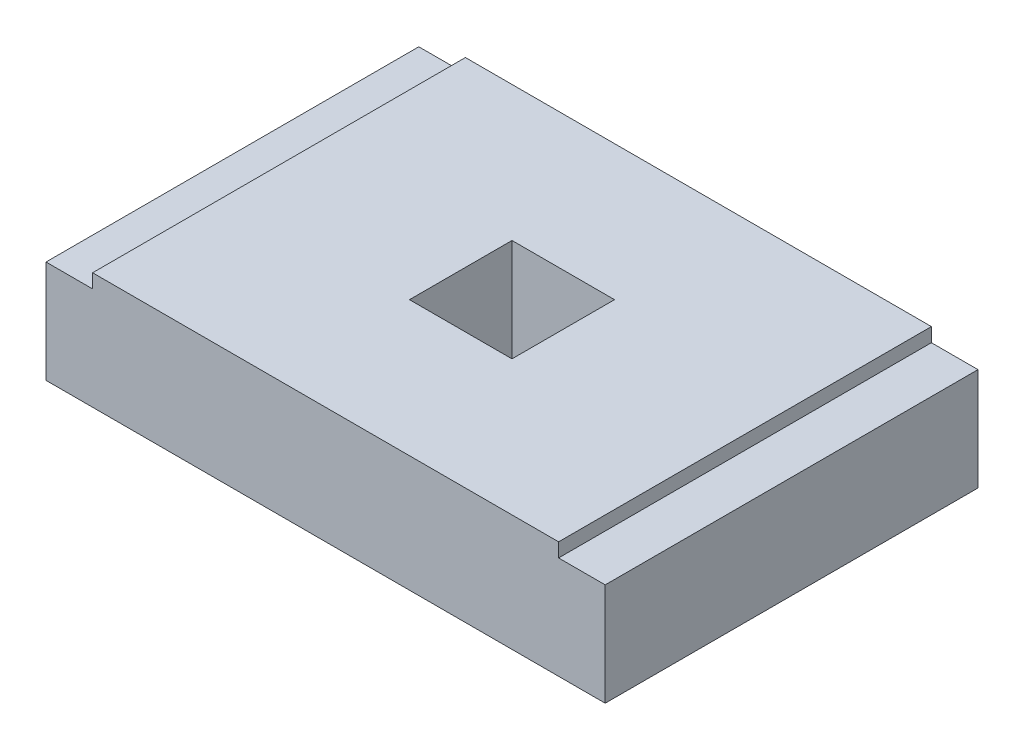
ISO-10303-21;
HEADER;
FILE_DESCRIPTION(('STEP AP214'),'2;1');
FILE_NAME('part.step','',(''),(''),'','','');
FILE_SCHEMA(('AUTOMOTIVE_DESIGN { 1 0 10303 214 1 1 1 1 }'));
ENDSEC;
DATA;
#1=APPLICATION_CONTEXT('core data for automotive mechanical design processes');
#2=APPLICATION_PROTOCOL_DEFINITION('international standard','automotive_design',2000,#1);
#3=PRODUCT_CONTEXT('',#1,'mechanical');
#4=PRODUCT('Part','Part','',(#3));
#5=PRODUCT_RELATED_PRODUCT_CATEGORY('part','',(#4));
#6=PRODUCT_DEFINITION_FORMATION('','',#4);
#7=PRODUCT_DEFINITION_CONTEXT('part definition',#1,'design');
#8=PRODUCT_DEFINITION('design','',#6,#7);
#9=PRODUCT_DEFINITION_SHAPE('','',#8);
#10=(LENGTH_UNIT() NAMED_UNIT(*) SI_UNIT(.MILLI.,.METRE.));
#11=(NAMED_UNIT(*) PLANE_ANGLE_UNIT() SI_UNIT($,.RADIAN.));
#12=(NAMED_UNIT(*) SI_UNIT($,.STERADIAN.) SOLID_ANGLE_UNIT());
#13=UNCERTAINTY_MEASURE_WITH_UNIT(LENGTH_MEASURE(1.E-05),#10,'distance_accuracy_value','');
#14=(GEOMETRIC_REPRESENTATION_CONTEXT(3) GLOBAL_UNCERTAINTY_ASSIGNED_CONTEXT((#13)) GLOBAL_UNIT_ASSIGNED_CONTEXT((#10,
#11,#12)) REPRESENTATION_CONTEXT('',''));
#15=CARTESIAN_POINT('',(0.,0.,0.));
#16=DIRECTION('',(0.,0.,1.));
#17=DIRECTION('',(1.,0.,0.));
#18=AXIS2_PLACEMENT_3D('',#15,#16,#17);
#19=CARTESIAN_POINT('',(0.,9.49999999999999,40.));
#20=DIRECTION('',(0.,1.,0.));
#21=DIRECTION('',(0.,0.,1.));
#22=AXIS2_PLACEMENT_3D('',#19,#20,#21);
#23=PLANE('',#22);
#24=DIRECTION('',(1.,0.,0.));
#25=VECTOR('',#24,1.);
#26=CARTESIAN_POINT('',(0.,9.49999999999999,-40.));
#27=LINE('',#26,#25);
#28=CARTESIAN_POINT('',(-60.,9.5,-40.));
#29=VERTEX_POINT('',#28);
#30=CARTESIAN_POINT('',(-50.,9.5,-40.));
#31=VERTEX_POINT('',#30);
#32=EDGE_CURVE('E177',#29,#31,#27,.T.);
#33=ORIENTED_EDGE('',*,*,#32,.F.);
#34=DIRECTION('',(0.,0.,-1.));
#35=VECTOR('',#34,1.);
#36=CARTESIAN_POINT('',(-60.,9.5,40.));
#37=LINE('',#36,#35);
#38=CARTESIAN_POINT('',(-60.,9.5,40.));
#39=VERTEX_POINT('',#38);
#40=EDGE_CURVE('E11',#39,#29,#37,.T.);
#41=ORIENTED_EDGE('',*,*,#40,.F.);
#42=DIRECTION('',(1.,0.,0.));
#43=VECTOR('',#42,1.);
#44=CARTESIAN_POINT('',(0.,9.49999999999999,40.));
#45=LINE('',#44,#43);
#46=CARTESIAN_POINT('',(-50.,9.5,40.));
#47=VERTEX_POINT('',#46);
#48=EDGE_CURVE('E183',#39,#47,#45,.T.);
#49=ORIENTED_EDGE('',*,*,#48,.T.);
#50=DIRECTION('',(0.,0.,-1.));
#51=VECTOR('',#50,1.);
#52=CARTESIAN_POINT('',(-50.,9.5,40.));
#53=LINE('',#52,#51);
#54=EDGE_CURVE('E209',#47,#31,#53,.T.);
#55=ORIENTED_EDGE('',*,*,#54,.T.);
#56=EDGE_LOOP('',(#33,#41,#49,#55));
#57=FACE_BOUND('',#56,.T.);
#58=ADVANCED_FACE('F45',(#57),#23,.T.);
#59=CARTESIAN_POINT('',(-60.,0.,40.));
#60=DIRECTION('',(1.,0.,0.));
#61=DIRECTION('',(0.,0.,-1.));
#62=AXIS2_PLACEMENT_3D('',#59,#60,#61);
#63=PLANE('',#62);
#64=DIRECTION('',(0.,-1.,0.));
#65=VECTOR('',#64,1.);
#66=CARTESIAN_POINT('',(-60.,0.,-40.));
#67=LINE('',#66,#65);
#68=CARTESIAN_POINT('',(-60.,-12.5,-40.));
#69=VERTEX_POINT('',#68);
#70=EDGE_CURVE('E213',#29,#69,#67,.T.);
#71=ORIENTED_EDGE('',*,*,#70,.T.);
#72=DIRECTION('',(0.,0.,-1.));
#73=VECTOR('',#72,1.);
#74=CARTESIAN_POINT('',(-60.,-12.5,40.));
#75=LINE('',#74,#73);
#76=CARTESIAN_POINT('',(-60.,-12.5,40.));
#77=VERTEX_POINT('',#76);
#78=EDGE_CURVE('E54',#77,#69,#75,.T.);
#79=ORIENTED_EDGE('',*,*,#78,.F.);
#80=DIRECTION('',(0.,-1.,0.));
#81=VECTOR('',#80,1.);
#82=CARTESIAN_POINT('',(-60.,0.,40.));
#83=LINE('',#82,#81);
#84=EDGE_CURVE('E187',#39,#77,#83,.T.);
#85=ORIENTED_EDGE('',*,*,#84,.F.);
#86=ORIENTED_EDGE('',*,*,#40,.T.);
#87=EDGE_LOOP('',(#71,#79,#85,#86));
#88=FACE_BOUND('',#87,.T.);
#89=ADVANCED_FACE('F47',(#88),#63,.F.);
#90=CARTESIAN_POINT('',(0.,-12.5,40.));
#91=DIRECTION('',(0.,-1.,0.));
#92=DIRECTION('',(1.,0.,0.));
#93=AXIS2_PLACEMENT_3D('',#90,#91,#92);
#94=PLANE('',#93);
#95=DIRECTION('',(0.,0.,-1.));
#96=VECTOR('',#95,1.);
#97=CARTESIAN_POINT('',(11.,-12.5,11.));
#98=LINE('',#97,#96);
#99=CARTESIAN_POINT('',(11.,-12.5,11.));
#100=VERTEX_POINT('',#99);
#101=CARTESIAN_POINT('',(11.,-12.5,-11.));
#102=VERTEX_POINT('',#101);
#103=EDGE_CURVE('E136',#100,#102,#98,.T.);
#104=ORIENTED_EDGE('',*,*,#103,.T.);
#105=DIRECTION('',(-1.,0.,0.));
#106=VECTOR('',#105,1.);
#107=CARTESIAN_POINT('',(-11.,-12.5,-11.));
#108=LINE('',#107,#106);
#109=CARTESIAN_POINT('',(-11.,-12.5,-11.));
#110=VERTEX_POINT('',#109);
#111=EDGE_CURVE('E146',#102,#110,#108,.T.);
#112=ORIENTED_EDGE('',*,*,#111,.T.);
#113=DIRECTION('',(0.,0.,1.));
#114=VECTOR('',#113,1.);
#115=CARTESIAN_POINT('',(-11.,-12.5,11.));
#116=LINE('',#115,#114);
#117=CARTESIAN_POINT('',(-11.,-12.5,11.));
#118=VERTEX_POINT('',#117);
#119=EDGE_CURVE('E61',#110,#118,#116,.T.);
#120=ORIENTED_EDGE('',*,*,#119,.T.);
#121=DIRECTION('',(1.,0.,0.));
#122=VECTOR('',#121,1.);
#123=CARTESIAN_POINT('',(-11.,-12.5,11.));
#124=LINE('',#123,#122);
#125=EDGE_CURVE('E143',#118,#100,#124,.T.);
#126=ORIENTED_EDGE('',*,*,#125,.T.);
#127=EDGE_LOOP('',(#104,#112,#120,#126));
#128=FACE_BOUND('',#127,.T.);
#129=DIRECTION('',(-1.,0.,0.));
#130=VECTOR('',#129,1.);
#131=CARTESIAN_POINT('',(0.,-12.5,-40.));
#132=LINE('',#131,#130);
#133=CARTESIAN_POINT('',(60.,-12.5,-40.));
#134=VERTEX_POINT('',#133);
#135=EDGE_CURVE('E218',#134,#69,#132,.T.);
#136=ORIENTED_EDGE('',*,*,#135,.F.);
#137=DIRECTION('',(0.,0.,-1.));
#138=VECTOR('',#137,1.);
#139=CARTESIAN_POINT('',(60.,-12.5,40.));
#140=LINE('',#139,#138);
#141=CARTESIAN_POINT('',(60.,-12.5,40.));
#142=VERTEX_POINT('',#141);
#143=EDGE_CURVE('E251',#142,#134,#140,.T.);
#144=ORIENTED_EDGE('',*,*,#143,.F.);
#145=DIRECTION('',(-1.,0.,0.));
#146=VECTOR('',#145,1.);
#147=CARTESIAN_POINT('',(0.,-12.5,40.));
#148=LINE('',#147,#146);
#149=EDGE_CURVE('E192',#142,#77,#148,.T.);
#150=ORIENTED_EDGE('',*,*,#149,.T.);
#151=ORIENTED_EDGE('',*,*,#78,.T.);
#152=EDGE_LOOP('',(#136,#144,#150,#151));
#153=FACE_BOUND('',#152,.T.);
#154=ADVANCED_FACE('F151',(#128,#153),#94,.T.);
#155=CARTESIAN_POINT('',(60.,0.,40.));
#156=DIRECTION('',(1.,0.,0.));
#157=DIRECTION('',(0.,0.,-1.));
#158=AXIS2_PLACEMENT_3D('',#155,#156,#157);
#159=PLANE('',#158);
#160=DIRECTION('',(0.,-1.,0.));
#161=VECTOR('',#160,1.);
#162=CARTESIAN_POINT('',(60.,0.,-40.));
#163=LINE('',#162,#161);
#164=CARTESIAN_POINT('',(60.,9.49999999999999,-40.));
#165=VERTEX_POINT('',#164);
#166=EDGE_CURVE('E222',#165,#134,#163,.T.);
#167=ORIENTED_EDGE('',*,*,#166,.F.);
#168=DIRECTION('',(0.,0.,-1.));
#169=VECTOR('',#168,1.);
#170=CARTESIAN_POINT('',(60.,9.49999999999999,40.));
#171=LINE('',#170,#169);
#172=CARTESIAN_POINT('',(60.,9.49999999999999,40.));
#173=VERTEX_POINT('',#172);
#174=EDGE_CURVE('E248',#173,#165,#171,.T.);
#175=ORIENTED_EDGE('',*,*,#174,.F.);
#176=DIRECTION('',(0.,-1.,0.));
#177=VECTOR('',#176,1.);
#178=CARTESIAN_POINT('',(60.,0.,40.));
#179=LINE('',#178,#177);
#180=EDGE_CURVE('E196',#173,#142,#179,.T.);
#181=ORIENTED_EDGE('',*,*,#180,.T.);
#182=ORIENTED_EDGE('',*,*,#143,.T.);
#183=EDGE_LOOP('',(#167,#175,#181,#182));
#184=FACE_BOUND('',#183,.T.);
#185=ADVANCED_FACE('F268',(#184),#159,.T.);
#186=CARTESIAN_POINT('',(50.,9.49999999999999,-40.));
#187=VERTEX_POINT('',#186);
#188=EDGE_CURVE('E214',#187,#165,#27,.T.);
#189=ORIENTED_EDGE('',*,*,#188,.F.);
#190=DIRECTION('',(0.,0.,-1.));
#191=VECTOR('',#190,1.);
#192=CARTESIAN_POINT('',(50.,9.49999999999999,40.));
#193=LINE('',#192,#191);
#194=CARTESIAN_POINT('',(50.,9.49999999999999,40.));
#195=VERTEX_POINT('',#194);
#196=EDGE_CURVE('E245',#195,#187,#193,.T.);
#197=ORIENTED_EDGE('',*,*,#196,.F.);
#198=EDGE_CURVE('E189',#195,#173,#45,.T.);
#199=ORIENTED_EDGE('',*,*,#198,.T.);
#200=ORIENTED_EDGE('',*,*,#174,.T.);
#201=EDGE_LOOP('',(#189,#197,#199,#200));
#202=FACE_BOUND('',#201,.T.);
#203=ADVANCED_FACE('F291',(#202),#23,.T.);
#204=CARTESIAN_POINT('',(50.,0.,40.));
#205=DIRECTION('',(-1.,0.,0.));
#206=DIRECTION('',(0.,0.,1.));
#207=AXIS2_PLACEMENT_3D('',#204,#205,#206);
#208=PLANE('',#207);
#209=DIRECTION('',(0.,1.,0.));
#210=VECTOR('',#209,1.);
#211=CARTESIAN_POINT('',(50.,0.,-40.));
#212=LINE('',#211,#210);
#213=CARTESIAN_POINT('',(50.,12.5,-40.));
#214=VERTEX_POINT('',#213);
#215=EDGE_CURVE('E226',#187,#214,#212,.T.);
#216=ORIENTED_EDGE('',*,*,#215,.T.);
#217=DIRECTION('',(0.,0.,-1.));
#218=VECTOR('',#217,1.);
#219=CARTESIAN_POINT('',(50.,12.5,40.));
#220=LINE('',#219,#218);
#221=CARTESIAN_POINT('',(50.,12.5,40.));
#222=VERTEX_POINT('',#221);
#223=EDGE_CURVE('E241',#222,#214,#220,.T.);
#224=ORIENTED_EDGE('',*,*,#223,.F.);
#225=DIRECTION('',(0.,1.,0.));
#226=VECTOR('',#225,1.);
#227=CARTESIAN_POINT('',(50.,0.,40.));
#228=LINE('',#227,#226);
#229=EDGE_CURVE('E200',#195,#222,#228,.T.);
#230=ORIENTED_EDGE('',*,*,#229,.F.);
#231=ORIENTED_EDGE('',*,*,#196,.T.);
#232=EDGE_LOOP('',(#216,#224,#230,#231));
#233=FACE_BOUND('',#232,.T.);
#234=ADVANCED_FACE('F289',(#233),#208,.F.);
#235=CARTESIAN_POINT('',(0.,12.5,40.));
#236=DIRECTION('',(0.,-1.,0.));
#237=DIRECTION('',(1.,0.,0.));
#238=AXIS2_PLACEMENT_3D('',#235,#236,#237);
#239=PLANE('',#238);
#240=DIRECTION('',(-1.,0.,0.));
#241=VECTOR('',#240,1.);
#242=CARTESIAN_POINT('',(-11.,12.5,-11.));
#243=LINE('',#242,#241);
#244=CARTESIAN_POINT('',(11.,12.5,-11.));
#245=VERTEX_POINT('',#244);
#246=CARTESIAN_POINT('',(-11.,12.5,-11.));
#247=VERTEX_POINT('',#246);
#248=EDGE_CURVE('E168',#245,#247,#243,.T.);
#249=ORIENTED_EDGE('',*,*,#248,.F.);
#250=DIRECTION('',(0.,0.,-1.));
#251=VECTOR('',#250,1.);
#252=CARTESIAN_POINT('',(11.,12.5,11.));
#253=LINE('',#252,#251);
#254=CARTESIAN_POINT('',(11.,12.5,11.));
#255=VERTEX_POINT('',#254);
#256=EDGE_CURVE('E69',#255,#245,#253,.T.);
#257=ORIENTED_EDGE('',*,*,#256,.F.);
#258=DIRECTION('',(1.,0.,0.));
#259=VECTOR('',#258,1.);
#260=CARTESIAN_POINT('',(-11.,12.5,11.));
#261=LINE('',#260,#259);
#262=CARTESIAN_POINT('',(-11.,12.5,11.));
#263=VERTEX_POINT('',#262);
#264=EDGE_CURVE('E155',#263,#255,#261,.T.);
#265=ORIENTED_EDGE('',*,*,#264,.F.);
#266=DIRECTION('',(0.,0.,1.));
#267=VECTOR('',#266,1.);
#268=CARTESIAN_POINT('',(-11.,12.5,11.));
#269=LINE('',#268,#267);
#270=EDGE_CURVE('E159',#247,#263,#269,.T.);
#271=ORIENTED_EDGE('',*,*,#270,.F.);
#272=EDGE_LOOP('',(#249,#257,#265,#271));
#273=FACE_BOUND('',#272,.T.);
#274=DIRECTION('',(-1.,0.,0.));
#275=VECTOR('',#274,1.);
#276=CARTESIAN_POINT('',(0.,12.5,-40.));
#277=LINE('',#276,#275);
#278=CARTESIAN_POINT('',(-50.,12.5,-40.));
#279=VERTEX_POINT('',#278);
#280=EDGE_CURVE('E229',#214,#279,#277,.T.);
#281=ORIENTED_EDGE('',*,*,#280,.T.);
#282=DIRECTION('',(0.,0.,-1.));
#283=VECTOR('',#282,1.);
#284=CARTESIAN_POINT('',(-50.,12.5,40.));
#285=LINE('',#284,#283);
#286=CARTESIAN_POINT('',(-50.,12.5,40.));
#287=VERTEX_POINT('',#286);
#288=EDGE_CURVE('E237',#287,#279,#285,.T.);
#289=ORIENTED_EDGE('',*,*,#288,.F.);
#290=DIRECTION('',(-1.,0.,0.));
#291=VECTOR('',#290,1.);
#292=CARTESIAN_POINT('',(0.,12.5,40.));
#293=LINE('',#292,#291);
#294=EDGE_CURVE('E203',#222,#287,#293,.T.);
#295=ORIENTED_EDGE('',*,*,#294,.F.);
#296=ORIENTED_EDGE('',*,*,#223,.T.);
#297=EDGE_LOOP('',(#281,#289,#295,#296));
#298=FACE_BOUND('',#297,.T.);
#299=ADVANCED_FACE('F285',(#273,#298),#239,.F.);
#300=CARTESIAN_POINT('',(-50.,0.,40.));
#301=DIRECTION('',(1.,0.,0.));
#302=DIRECTION('',(0.,0.,-1.));
#303=AXIS2_PLACEMENT_3D('',#300,#301,#302);
#304=PLANE('',#303);
#305=DIRECTION('',(0.,-1.,0.));
#306=VECTOR('',#305,1.);
#307=CARTESIAN_POINT('',(-50.,0.,-40.));
#308=LINE('',#307,#306);
#309=EDGE_CURVE('E188',#279,#31,#308,.T.);
#310=ORIENTED_EDGE('',*,*,#309,.T.);
#311=ORIENTED_EDGE('',*,*,#54,.F.);
#312=DIRECTION('',(0.,-1.,0.));
#313=VECTOR('',#312,1.);
#314=CARTESIAN_POINT('',(-50.,0.,40.));
#315=LINE('',#314,#313);
#316=EDGE_CURVE('E206',#287,#47,#315,.T.);
#317=ORIENTED_EDGE('',*,*,#316,.F.);
#318=ORIENTED_EDGE('',*,*,#288,.T.);
#319=EDGE_LOOP('',(#310,#311,#317,#318));
#320=FACE_BOUND('',#319,.T.);
#321=ADVANCED_FACE('F281',(#320),#304,.F.);
#322=CARTESIAN_POINT('',(0.,0.,40.));
#323=DIRECTION('',(0.,0.,1.));
#324=DIRECTION('',(1.,0.,0.));
#325=AXIS2_PLACEMENT_3D('',#322,#323,#324);
#326=PLANE('',#325);
#327=ORIENTED_EDGE('',*,*,#48,.F.);
#328=ORIENTED_EDGE('',*,*,#84,.T.);
#329=ORIENTED_EDGE('',*,*,#149,.F.);
#330=ORIENTED_EDGE('',*,*,#180,.F.);
#331=ORIENTED_EDGE('',*,*,#198,.F.);
#332=ORIENTED_EDGE('',*,*,#229,.T.);
#333=ORIENTED_EDGE('',*,*,#294,.T.);
#334=ORIENTED_EDGE('',*,*,#316,.T.);
#335=EDGE_LOOP('',(#327,#328,#329,#330,#331,#332,#333,#334));
#336=FACE_BOUND('',#335,.T.);
#337=ADVANCED_FACE('F272',(#336),#326,.T.);
#338=CARTESIAN_POINT('',(0.,0.,-40.));
#339=DIRECTION('',(0.,0.,1.));
#340=DIRECTION('',(1.,0.,0.));
#341=AXIS2_PLACEMENT_3D('',#338,#339,#340);
#342=PLANE('',#341);
#343=ORIENTED_EDGE('',*,*,#32,.T.);
#344=ORIENTED_EDGE('',*,*,#309,.F.);
#345=ORIENTED_EDGE('',*,*,#280,.F.);
#346=ORIENTED_EDGE('',*,*,#215,.F.);
#347=ORIENTED_EDGE('',*,*,#188,.T.);
#348=ORIENTED_EDGE('',*,*,#166,.T.);
#349=ORIENTED_EDGE('',*,*,#135,.T.);
#350=ORIENTED_EDGE('',*,*,#70,.F.);
#351=EDGE_LOOP('',(#343,#344,#345,#346,#347,#348,#349,#350));
#352=FACE_BOUND('',#351,.T.);
#353=ADVANCED_FACE('F262',(#352),#342,.F.);
#354=CARTESIAN_POINT('',(11.,-12.5,11.));
#355=DIRECTION('',(1.,0.,0.));
#356=DIRECTION('',(0.,1.,0.));
#357=AXIS2_PLACEMENT_3D('',#354,#355,#356);
#358=PLANE('',#357);
#359=ORIENTED_EDGE('',*,*,#256,.T.);
#360=DIRECTION('',(0.,1.,0.));
#361=VECTOR('',#360,1.);
#362=CARTESIAN_POINT('',(11.,-12.5,-11.));
#363=LINE('',#362,#361);
#364=EDGE_CURVE('E132',#102,#245,#363,.T.);
#365=ORIENTED_EDGE('',*,*,#364,.F.);
#366=ORIENTED_EDGE('',*,*,#103,.F.);
#367=DIRECTION('',(0.,1.,0.));
#368=VECTOR('',#367,1.);
#369=CARTESIAN_POINT('',(11.,-12.5,11.));
#370=LINE('',#369,#368);
#371=EDGE_CURVE('E174',#100,#255,#370,.T.);
#372=ORIENTED_EDGE('',*,*,#371,.T.);
#373=EDGE_LOOP('',(#359,#365,#366,#372));
#374=FACE_BOUND('',#373,.T.);
#375=ADVANCED_FACE('F134',(#374),#358,.F.);
#376=CARTESIAN_POINT('',(-11.,-12.5,11.));
#377=DIRECTION('',(0.,0.,1.));
#378=DIRECTION('',(1.,0.,0.));
#379=AXIS2_PLACEMENT_3D('',#376,#377,#378);
#380=PLANE('',#379);
#381=ORIENTED_EDGE('',*,*,#264,.T.);
#382=ORIENTED_EDGE('',*,*,#371,.F.);
#383=ORIENTED_EDGE('',*,*,#125,.F.);
#384=DIRECTION('',(0.,1.,0.));
#385=VECTOR('',#384,1.);
#386=CARTESIAN_POINT('',(-11.,-12.5,11.));
#387=LINE('',#386,#385);
#388=EDGE_CURVE('E178',#118,#263,#387,.T.);
#389=ORIENTED_EDGE('',*,*,#388,.T.);
#390=EDGE_LOOP('',(#381,#382,#383,#389));
#391=FACE_BOUND('',#390,.T.);
#392=ADVANCED_FACE('F370',(#391),#380,.F.);
#393=CARTESIAN_POINT('',(-11.,-12.5,11.));
#394=DIRECTION('',(-1.,0.,0.));
#395=DIRECTION('',(0.,-1.,0.));
#396=AXIS2_PLACEMENT_3D('',#393,#394,#395);
#397=PLANE('',#396);
#398=ORIENTED_EDGE('',*,*,#270,.T.);
#399=ORIENTED_EDGE('',*,*,#388,.F.);
#400=ORIENTED_EDGE('',*,*,#119,.F.);
#401=DIRECTION('',(0.,1.,0.));
#402=VECTOR('',#401,1.);
#403=CARTESIAN_POINT('',(-11.,-12.5,-11.));
#404=LINE('',#403,#402);
#405=EDGE_CURVE('E142',#110,#247,#404,.T.);
#406=ORIENTED_EDGE('',*,*,#405,.T.);
#407=EDGE_LOOP('',(#398,#399,#400,#406));
#408=FACE_BOUND('',#407,.T.);
#409=ADVANCED_FACE('F376',(#408),#397,.F.);
#410=CARTESIAN_POINT('',(-11.,-12.5,-11.));
#411=DIRECTION('',(0.,0.,-1.));
#412=DIRECTION('',(-1.,0.,0.));
#413=AXIS2_PLACEMENT_3D('',#410,#411,#412);
#414=PLANE('',#413);
#415=ORIENTED_EDGE('',*,*,#248,.T.);
#416=ORIENTED_EDGE('',*,*,#405,.F.);
#417=ORIENTED_EDGE('',*,*,#111,.F.);
#418=ORIENTED_EDGE('',*,*,#364,.T.);
#419=EDGE_LOOP('',(#415,#416,#417,#418));
#420=FACE_BOUND('',#419,.T.);
#421=ADVANCED_FACE('F147',(#420),#414,.F.);
#422=CLOSED_SHELL('',(#58,#89,#154,#185,#203,#234,#299,#321,#337,#353,#375,#392,#409,#421));
#423=MANIFOLD_SOLID_BREP('B2',#422);
#424=ADVANCED_BREP_SHAPE_REPRESENTATION('',(#18,#423),#14);
#425=SHAPE_DEFINITION_REPRESENTATION(#9,#424);
ENDSEC;
END-ISO-10303-21;
